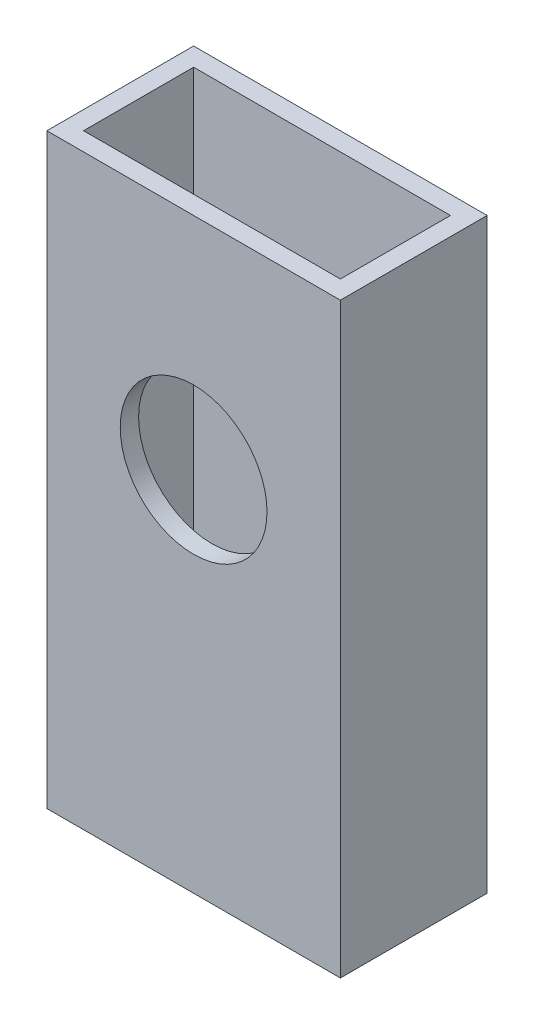
ISO-10303-21;
HEADER;
FILE_DESCRIPTION(('STEP AP214'),'2;1');
FILE_NAME('part.step','',(''),(''),'','','');
FILE_SCHEMA(('AUTOMOTIVE_DESIGN { 1 0 10303 214 1 1 1 1 }'));
ENDSEC;
DATA;
#1=APPLICATION_CONTEXT('core data for automotive mechanical design processes');
#2=APPLICATION_PROTOCOL_DEFINITION('international standard','automotive_design',2000,#1);
#3=PRODUCT_CONTEXT('',#1,'mechanical');
#4=PRODUCT('Part','Part','',(#3));
#5=PRODUCT_RELATED_PRODUCT_CATEGORY('part','',(#4));
#6=PRODUCT_DEFINITION_FORMATION('','',#4);
#7=PRODUCT_DEFINITION_CONTEXT('part definition',#1,'design');
#8=PRODUCT_DEFINITION('design','',#6,#7);
#9=PRODUCT_DEFINITION_SHAPE('','',#8);
#10=(LENGTH_UNIT() NAMED_UNIT(*) SI_UNIT(.MILLI.,.METRE.));
#11=(NAMED_UNIT(*) PLANE_ANGLE_UNIT() SI_UNIT($,.RADIAN.));
#12=(NAMED_UNIT(*) SI_UNIT($,.STERADIAN.) SOLID_ANGLE_UNIT());
#13=UNCERTAINTY_MEASURE_WITH_UNIT(LENGTH_MEASURE(1.E-05),#10,'distance_accuracy_value','');
#14=(GEOMETRIC_REPRESENTATION_CONTEXT(3) GLOBAL_UNCERTAINTY_ASSIGNED_CONTEXT((#13)) GLOBAL_UNIT_ASSIGNED_CONTEXT((#10,
#11,#12)) REPRESENTATION_CONTEXT('',''));
#15=CARTESIAN_POINT('',(0.,0.,0.));
#16=DIRECTION('',(0.,0.,1.));
#17=DIRECTION('',(1.,0.,0.));
#18=AXIS2_PLACEMENT_3D('',#15,#16,#17);
#19=CARTESIAN_POINT('',(0.,0.,25.4));
#20=DIRECTION('',(1.,0.,0.));
#21=DIRECTION('',(0.,0.,-1.));
#22=AXIS2_PLACEMENT_3D('',#19,#20,#21);
#23=PLANE('',#22);
#24=DIRECTION('',(0.,-1.,0.));
#25=VECTOR('',#24,1.);
#26=CARTESIAN_POINT('',(0.,0.,0.));
#27=LINE('',#26,#25);
#28=CARTESIAN_POINT('',(0.,101.6,0.));
#29=VERTEX_POINT('',#28);
#30=CARTESIAN_POINT('',(0.,0.,0.));
#31=VERTEX_POINT('',#30);
#32=EDGE_CURVE('E150',#29,#31,#27,.T.);
#33=ORIENTED_EDGE('',*,*,#32,.T.);
#34=DIRECTION('',(0.,0.,-1.));
#35=VECTOR('',#34,1.);
#36=CARTESIAN_POINT('',(0.,0.,25.4));
#37=LINE('',#36,#35);
#38=CARTESIAN_POINT('',(0.,0.,25.4));
#39=VERTEX_POINT('',#38);
#40=EDGE_CURVE('E11',#39,#31,#37,.T.);
#41=ORIENTED_EDGE('',*,*,#40,.F.);
#42=DIRECTION('',(0.,-1.,0.));
#43=VECTOR('',#42,1.);
#44=CARTESIAN_POINT('',(0.,0.,25.4));
#45=LINE('',#44,#43);
#46=CARTESIAN_POINT('',(0.,101.6,25.4));
#47=VERTEX_POINT('',#46);
#48=EDGE_CURVE('E156',#47,#39,#45,.T.);
#49=ORIENTED_EDGE('',*,*,#48,.F.);
#50=DIRECTION('',(0.,0.,-1.));
#51=VECTOR('',#50,1.);
#52=CARTESIAN_POINT('',(0.,101.6,25.4));
#53=LINE('',#52,#51);
#54=EDGE_CURVE('E170',#47,#29,#53,.T.);
#55=ORIENTED_EDGE('',*,*,#54,.T.);
#56=EDGE_LOOP('',(#33,#41,#49,#55));
#57=FACE_BOUND('',#56,.T.);
#58=ADVANCED_FACE('F39',(#57),#23,.F.);
#59=CARTESIAN_POINT('',(0.,0.,25.4));
#60=DIRECTION('',(0.,1.,0.));
#61=DIRECTION('',(0.,0.,1.));
#62=AXIS2_PLACEMENT_3D('',#59,#60,#61);
#63=PLANE('',#62);
#64=DIRECTION('',(1.,0.,0.));
#65=VECTOR('',#64,1.);
#66=CARTESIAN_POINT('',(3.175,0.,3.175));
#67=LINE('',#66,#65);
#68=CARTESIAN_POINT('',(3.175,0.,3.175));
#69=VERTEX_POINT('',#68);
#70=CARTESIAN_POINT('',(47.625,0.,3.175));
#71=VERTEX_POINT('',#70);
#72=EDGE_CURVE('E141',#69,#71,#67,.T.);
#73=ORIENTED_EDGE('',*,*,#72,.F.);
#74=DIRECTION('',(0.,0.,-1.));
#75=VECTOR('',#74,1.);
#76=CARTESIAN_POINT('',(3.175,0.,22.225));
#77=LINE('',#76,#75);
#78=CARTESIAN_POINT('',(3.175,0.,22.225));
#79=VERTEX_POINT('',#78);
#80=EDGE_CURVE('E55',#79,#69,#77,.T.);
#81=ORIENTED_EDGE('',*,*,#80,.F.);
#82=DIRECTION('',(-1.,0.,0.));
#83=VECTOR('',#82,1.);
#84=CARTESIAN_POINT('',(3.175,0.,22.225));
#85=LINE('',#84,#83);
#86=CARTESIAN_POINT('',(47.625,0.,22.225));
#87=VERTEX_POINT('',#86);
#88=EDGE_CURVE('E126',#87,#79,#85,.T.);
#89=ORIENTED_EDGE('',*,*,#88,.F.);
#90=DIRECTION('',(0.,0.,1.));
#91=VECTOR('',#90,1.);
#92=CARTESIAN_POINT('',(47.625,0.,22.225));
#93=LINE('',#92,#91);
#94=EDGE_CURVE('E130',#71,#87,#93,.T.);
#95=ORIENTED_EDGE('',*,*,#94,.F.);
#96=EDGE_LOOP('',(#73,#81,#89,#95));
#97=FACE_BOUND('',#96,.T.);
#98=DIRECTION('',(1.,0.,0.));
#99=VECTOR('',#98,1.);
#100=CARTESIAN_POINT('',(0.,0.,0.));
#101=LINE('',#100,#99);
#102=CARTESIAN_POINT('',(50.8,0.,0.));
#103=VERTEX_POINT('',#102);
#104=EDGE_CURVE('E174',#31,#103,#101,.T.);
#105=ORIENTED_EDGE('',*,*,#104,.T.);
#106=DIRECTION('',(0.,0.,-1.));
#107=VECTOR('',#106,1.);
#108=CARTESIAN_POINT('',(50.8,0.,25.4));
#109=LINE('',#108,#107);
#110=CARTESIAN_POINT('',(50.8,0.,25.4));
#111=VERTEX_POINT('',#110);
#112=EDGE_CURVE('E48',#111,#103,#109,.T.);
#113=ORIENTED_EDGE('',*,*,#112,.F.);
#114=DIRECTION('',(1.,0.,0.));
#115=VECTOR('',#114,1.);
#116=CARTESIAN_POINT('',(0.,0.,25.4));
#117=LINE('',#116,#115);
#118=EDGE_CURVE('E160',#39,#111,#117,.T.);
#119=ORIENTED_EDGE('',*,*,#118,.F.);
#120=ORIENTED_EDGE('',*,*,#40,.T.);
#121=EDGE_LOOP('',(#105,#113,#119,#120));
#122=FACE_BOUND('',#121,.T.);
#123=ADVANCED_FACE('F209',(#97,#122),#63,.F.);
#124=CARTESIAN_POINT('',(50.8,0.,25.4));
#125=DIRECTION('',(-1.,0.,0.));
#126=DIRECTION('',(0.,0.,1.));
#127=AXIS2_PLACEMENT_3D('',#124,#125,#126);
#128=PLANE('',#127);
#129=DIRECTION('',(0.,1.,0.));
#130=VECTOR('',#129,1.);
#131=CARTESIAN_POINT('',(50.8,0.,0.));
#132=LINE('',#131,#130);
#133=CARTESIAN_POINT('',(50.8,101.6,0.));
#134=VERTEX_POINT('',#133);
#135=EDGE_CURVE('E177',#103,#134,#132,.T.);
#136=ORIENTED_EDGE('',*,*,#135,.T.);
#137=DIRECTION('',(0.,0.,-1.));
#138=VECTOR('',#137,1.);
#139=CARTESIAN_POINT('',(50.8,101.6,25.4));
#140=LINE('',#139,#138);
#141=CARTESIAN_POINT('',(50.8,101.6,25.4));
#142=VERTEX_POINT('',#141);
#143=EDGE_CURVE('E185',#142,#134,#140,.T.);
#144=ORIENTED_EDGE('',*,*,#143,.F.);
#145=DIRECTION('',(0.,1.,0.));
#146=VECTOR('',#145,1.);
#147=CARTESIAN_POINT('',(50.8,0.,25.4));
#148=LINE('',#147,#146);
#149=EDGE_CURVE('E164',#111,#142,#148,.T.);
#150=ORIENTED_EDGE('',*,*,#149,.F.);
#151=ORIENTED_EDGE('',*,*,#112,.T.);
#152=EDGE_LOOP('',(#136,#144,#150,#151));
#153=FACE_BOUND('',#152,.T.);
#154=ADVANCED_FACE('F195',(#153),#128,.F.);
#155=CARTESIAN_POINT('',(0.,101.6,25.4));
#156=DIRECTION('',(0.,-1.,0.));
#157=DIRECTION('',(0.,0.,-1.));
#158=AXIS2_PLACEMENT_3D('',#155,#156,#157);
#159=PLANE('',#158);
#160=DIRECTION('',(-1.,0.,0.));
#161=VECTOR('',#160,1.);
#162=CARTESIAN_POINT('',(3.175,101.6,22.225));
#163=LINE('',#162,#161);
#164=CARTESIAN_POINT('',(47.625,101.6,22.225));
#165=VERTEX_POINT('',#164);
#166=CARTESIAN_POINT('',(3.175,101.6,22.225));
#167=VERTEX_POINT('',#166);
#168=EDGE_CURVE('E114',#165,#167,#163,.T.);
#169=ORIENTED_EDGE('',*,*,#168,.T.);
#170=DIRECTION('',(0.,0.,-1.));
#171=VECTOR('',#170,1.);
#172=CARTESIAN_POINT('',(3.175,101.6,22.225));
#173=LINE('',#172,#171);
#174=CARTESIAN_POINT('',(3.175,101.6,3.175));
#175=VERTEX_POINT('',#174);
#176=EDGE_CURVE('E107',#167,#175,#173,.T.);
#177=ORIENTED_EDGE('',*,*,#176,.T.);
#178=DIRECTION('',(1.,0.,0.));
#179=VECTOR('',#178,1.);
#180=CARTESIAN_POINT('',(3.175,101.6,3.175));
#181=LINE('',#180,#179);
#182=CARTESIAN_POINT('',(47.625,101.6,3.175));
#183=VERTEX_POINT('',#182);
#184=EDGE_CURVE('E117',#175,#183,#181,.T.);
#185=ORIENTED_EDGE('',*,*,#184,.T.);
#186=DIRECTION('',(0.,0.,1.));
#187=VECTOR('',#186,1.);
#188=CARTESIAN_POINT('',(47.625,101.6,22.225));
#189=LINE('',#188,#187);
#190=EDGE_CURVE('E63',#183,#165,#189,.T.);
#191=ORIENTED_EDGE('',*,*,#190,.T.);
#192=EDGE_LOOP('',(#169,#177,#185,#191));
#193=FACE_BOUND('',#192,.T.);
#194=DIRECTION('',(-1.,0.,0.));
#195=VECTOR('',#194,1.);
#196=CARTESIAN_POINT('',(0.,101.6,0.));
#197=LINE('',#196,#195);
#198=EDGE_CURVE('E161',#134,#29,#197,.T.);
#199=ORIENTED_EDGE('',*,*,#198,.T.);
#200=ORIENTED_EDGE('',*,*,#54,.F.);
#201=DIRECTION('',(-1.,0.,0.));
#202=VECTOR('',#201,1.);
#203=CARTESIAN_POINT('',(0.,101.6,25.4));
#204=LINE('',#203,#202);
#205=EDGE_CURVE('E167',#142,#47,#204,.T.);
#206=ORIENTED_EDGE('',*,*,#205,.F.);
#207=ORIENTED_EDGE('',*,*,#143,.T.);
#208=EDGE_LOOP('',(#199,#200,#206,#207));
#209=FACE_BOUND('',#208,.T.);
#210=ADVANCED_FACE('F122',(#193,#209),#159,.F.);
#211=CARTESIAN_POINT('',(0.,0.,25.4));
#212=DIRECTION('',(0.,0.,-1.));
#213=DIRECTION('',(-1.,0.,0.));
#214=AXIS2_PLACEMENT_3D('',#211,#212,#213);
#215=PLANE('',#214);
#216=CARTESIAN_POINT('',(25.4,63.5,25.4));
#217=DIRECTION('',(0.,0.,1.));
#218=DIRECTION('',(1.,0.,0.));
#219=AXIS2_PLACEMENT_3D('',#216,#217,#218);
#220=CIRCLE('',#219,12.7);
#221=CARTESIAN_POINT('',(38.1,63.5,25.4));
#222=VERTEX_POINT('',#221);
#223=EDGE_CURVE('E133',#222,#222,#220,.T.);
#224=ORIENTED_EDGE('',*,*,#223,.F.);
#225=EDGE_LOOP('',(#224));
#226=FACE_BOUND('',#225,.T.);
#227=ORIENTED_EDGE('',*,*,#48,.T.);
#228=ORIENTED_EDGE('',*,*,#118,.T.);
#229=ORIENTED_EDGE('',*,*,#149,.T.);
#230=ORIENTED_EDGE('',*,*,#205,.T.);
#231=EDGE_LOOP('',(#227,#228,#229,#230));
#232=FACE_BOUND('',#231,.T.);
#233=ADVANCED_FACE('F208',(#226,#232),#215,.F.);
#234=CARTESIAN_POINT('',(0.,0.,0.));
#235=DIRECTION('',(0.,0.,-1.));
#236=DIRECTION('',(-1.,0.,0.));
#237=AXIS2_PLACEMENT_3D('',#234,#235,#236);
#238=PLANE('',#237);
#239=ORIENTED_EDGE('',*,*,#32,.F.);
#240=ORIENTED_EDGE('',*,*,#198,.F.);
#241=ORIENTED_EDGE('',*,*,#135,.F.);
#242=ORIENTED_EDGE('',*,*,#104,.F.);
#243=EDGE_LOOP('',(#239,#240,#241,#242));
#244=FACE_BOUND('',#243,.T.);
#245=ADVANCED_FACE('F201',(#244),#238,.T.);
#246=CARTESIAN_POINT('',(3.175,101.6,22.225));
#247=DIRECTION('',(-1.,0.,0.));
#248=DIRECTION('',(0.,0.,1.));
#249=AXIS2_PLACEMENT_3D('',#246,#247,#248);
#250=PLANE('',#249);
#251=ORIENTED_EDGE('',*,*,#80,.T.);
#252=DIRECTION('',(0.,-1.,0.));
#253=VECTOR('',#252,1.);
#254=CARTESIAN_POINT('',(3.175,101.6,3.175));
#255=LINE('',#254,#253);
#256=EDGE_CURVE('E103',#175,#69,#255,.T.);
#257=ORIENTED_EDGE('',*,*,#256,.F.);
#258=ORIENTED_EDGE('',*,*,#176,.F.);
#259=DIRECTION('',(0.,-1.,0.));
#260=VECTOR('',#259,1.);
#261=CARTESIAN_POINT('',(3.175,101.6,22.225));
#262=LINE('',#261,#260);
#263=EDGE_CURVE('E147',#167,#79,#262,.T.);
#264=ORIENTED_EDGE('',*,*,#263,.T.);
#265=EDGE_LOOP('',(#251,#257,#258,#264));
#266=FACE_BOUND('',#265,.T.);
#267=ADVANCED_FACE('F105',(#266),#250,.F.);
#268=CARTESIAN_POINT('',(3.175,101.6,22.225));
#269=DIRECTION('',(0.,0.,1.));
#270=DIRECTION('',(1.,0.,0.));
#271=AXIS2_PLACEMENT_3D('',#268,#269,#270);
#272=PLANE('',#271);
#273=CARTESIAN_POINT('',(25.4,63.5,22.225));
#274=DIRECTION('',(0.,0.,1.));
#275=DIRECTION('',(1.,0.,0.));
#276=AXIS2_PLACEMENT_3D('',#273,#274,#275);
#277=CIRCLE('',#276,12.7);
#278=CARTESIAN_POINT('',(38.1,63.5,22.225));
#279=VERTEX_POINT('',#278);
#280=EDGE_CURVE('E42',#279,#279,#277,.T.);
#281=ORIENTED_EDGE('',*,*,#280,.T.);
#282=EDGE_LOOP('',(#281));
#283=FACE_BOUND('',#282,.T.);
#284=ORIENTED_EDGE('',*,*,#88,.T.);
#285=ORIENTED_EDGE('',*,*,#263,.F.);
#286=ORIENTED_EDGE('',*,*,#168,.F.);
#287=DIRECTION('',(0.,-1.,0.));
#288=VECTOR('',#287,1.);
#289=CARTESIAN_POINT('',(47.625,101.6,22.225));
#290=LINE('',#289,#288);
#291=EDGE_CURVE('E151',#165,#87,#290,.T.);
#292=ORIENTED_EDGE('',*,*,#291,.T.);
#293=EDGE_LOOP('',(#284,#285,#286,#292));
#294=FACE_BOUND('',#293,.T.);
#295=ADVANCED_FACE('F227',(#283,#294),#272,.F.);
#296=CARTESIAN_POINT('',(47.625,101.6,22.225));
#297=DIRECTION('',(1.,0.,0.));
#298=DIRECTION('',(0.,0.,-1.));
#299=AXIS2_PLACEMENT_3D('',#296,#297,#298);
#300=PLANE('',#299);
#301=ORIENTED_EDGE('',*,*,#94,.T.);
#302=ORIENTED_EDGE('',*,*,#291,.F.);
#303=ORIENTED_EDGE('',*,*,#190,.F.);
#304=DIRECTION('',(0.,-1.,0.));
#305=VECTOR('',#304,1.);
#306=CARTESIAN_POINT('',(47.625,101.6,3.175));
#307=LINE('',#306,#305);
#308=EDGE_CURVE('E113',#183,#71,#307,.T.);
#309=ORIENTED_EDGE('',*,*,#308,.T.);
#310=EDGE_LOOP('',(#301,#302,#303,#309));
#311=FACE_BOUND('',#310,.T.);
#312=ADVANCED_FACE('F231',(#311),#300,.F.);
#313=CARTESIAN_POINT('',(3.175,101.6,3.175));
#314=DIRECTION('',(0.,0.,-1.));
#315=DIRECTION('',(-1.,0.,0.));
#316=AXIS2_PLACEMENT_3D('',#313,#314,#315);
#317=PLANE('',#316);
#318=ORIENTED_EDGE('',*,*,#72,.T.);
#319=ORIENTED_EDGE('',*,*,#308,.F.);
#320=ORIENTED_EDGE('',*,*,#184,.F.);
#321=ORIENTED_EDGE('',*,*,#256,.T.);
#322=EDGE_LOOP('',(#318,#319,#320,#321));
#323=FACE_BOUND('',#322,.T.);
#324=ADVANCED_FACE('F118',(#323),#317,.F.);
#325=CARTESIAN_POINT('',(25.4,63.5,19.05));
#326=DIRECTION('',(0.,0.,1.));
#327=DIRECTION('',(1.,0.,0.));
#328=AXIS2_PLACEMENT_3D('',#325,#326,#327);
#329=CYLINDRICAL_SURFACE('',#328,12.7);
#330=ORIENTED_EDGE('',*,*,#223,.T.);
#331=EDGE_LOOP('',(#330));
#332=FACE_BOUND('',#331,.T.);
#333=ORIENTED_EDGE('',*,*,#280,.F.);
#334=EDGE_LOOP('',(#333));
#335=FACE_BOUND('',#334,.T.);
#336=ADVANCED_FACE('F230',(#332,#335),#329,.F.);
#337=CLOSED_SHELL('',(#58,#123,#154,#210,#233,#245,#267,#295,#312,#324,#336));
#338=MANIFOLD_SOLID_BREP('B2',#337);
#339=ADVANCED_BREP_SHAPE_REPRESENTATION('',(#18,#338),#14);
#340=SHAPE_DEFINITION_REPRESENTATION(#9,#339);
ENDSEC;
END-ISO-10303-21;
